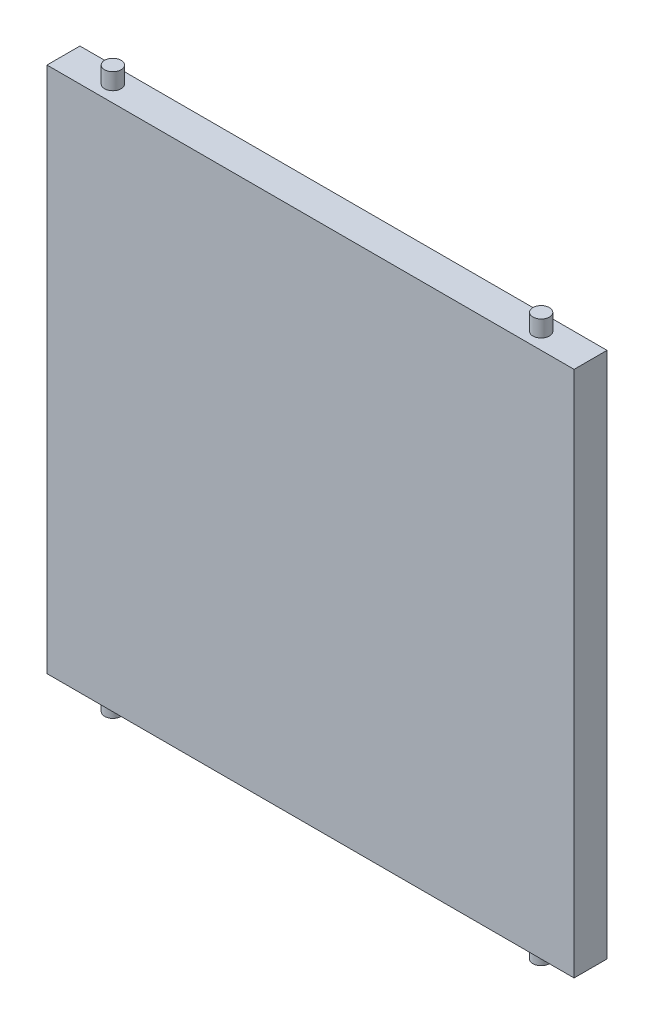
ISO-10303-21;
HEADER;
FILE_DESCRIPTION(('STEP AP214'),'2;1');
FILE_NAME('part.step','',(''),(''),'','','');
FILE_SCHEMA(('AUTOMOTIVE_DESIGN { 1 0 10303 214 1 1 1 1 }'));
ENDSEC;
DATA;
#1=APPLICATION_CONTEXT('core data for automotive mechanical design processes');
#2=APPLICATION_PROTOCOL_DEFINITION('international standard','automotive_design',2000,#1);
#3=PRODUCT_CONTEXT('',#1,'mechanical');
#4=PRODUCT('Part','Part','',(#3));
#5=PRODUCT_RELATED_PRODUCT_CATEGORY('part','',(#4));
#6=PRODUCT_DEFINITION_FORMATION('','',#4);
#7=PRODUCT_DEFINITION_CONTEXT('part definition',#1,'design');
#8=PRODUCT_DEFINITION('design','',#6,#7);
#9=PRODUCT_DEFINITION_SHAPE('','',#8);
#10=(LENGTH_UNIT() NAMED_UNIT(*) SI_UNIT(.MILLI.,.METRE.));
#11=(NAMED_UNIT(*) PLANE_ANGLE_UNIT() SI_UNIT($,.RADIAN.));
#12=(NAMED_UNIT(*) SI_UNIT($,.STERADIAN.) SOLID_ANGLE_UNIT());
#13=UNCERTAINTY_MEASURE_WITH_UNIT(LENGTH_MEASURE(1.E-05),#10,'distance_accuracy_value','');
#14=(GEOMETRIC_REPRESENTATION_CONTEXT(3) GLOBAL_UNCERTAINTY_ASSIGNED_CONTEXT((#13)) GLOBAL_UNIT_ASSIGNED_CONTEXT((#10,
#11,#12)) REPRESENTATION_CONTEXT('',''));
#15=CARTESIAN_POINT('',(0.,0.,0.));
#16=DIRECTION('',(0.,0.,1.));
#17=DIRECTION('',(1.,0.,0.));
#18=AXIS2_PLACEMENT_3D('',#15,#16,#17);
#19=CARTESIAN_POINT('',(80.,-80.,10.));
#20=DIRECTION('',(-1.,0.,0.));
#21=DIRECTION('',(0.,0.,1.));
#22=AXIS2_PLACEMENT_3D('',#19,#20,#21);
#23=PLANE('',#22);
#24=DIRECTION('',(0.,1.,0.));
#25=VECTOR('',#24,1.);
#26=CARTESIAN_POINT('',(80.,-80.,0.));
#27=LINE('',#26,#25);
#28=CARTESIAN_POINT('',(80.,-80.,0.));
#29=VERTEX_POINT('',#28);
#30=CARTESIAN_POINT('',(80.,80.,0.));
#31=VERTEX_POINT('',#30);
#32=EDGE_CURVE('E104',#29,#31,#27,.T.);
#33=ORIENTED_EDGE('',*,*,#32,.T.);
#34=DIRECTION('',(0.,0.,-1.));
#35=VECTOR('',#34,1.);
#36=CARTESIAN_POINT('',(80.,80.,10.));
#37=LINE('',#36,#35);
#38=CARTESIAN_POINT('',(80.,80.,10.));
#39=VERTEX_POINT('',#38);
#40=EDGE_CURVE('E95',#39,#31,#37,.T.);
#41=ORIENTED_EDGE('',*,*,#40,.F.);
#42=DIRECTION('',(0.,1.,0.));
#43=VECTOR('',#42,1.);
#44=CARTESIAN_POINT('',(80.,-80.,10.));
#45=LINE('',#44,#43);
#46=CARTESIAN_POINT('',(80.,-80.,10.));
#47=VERTEX_POINT('',#46);
#48=EDGE_CURVE('E89',#47,#39,#45,.T.);
#49=ORIENTED_EDGE('',*,*,#48,.F.);
#50=DIRECTION('',(0.,0.,-1.));
#51=VECTOR('',#50,1.);
#52=CARTESIAN_POINT('',(80.,-80.,10.));
#53=LINE('',#52,#51);
#54=EDGE_CURVE('E100',#47,#29,#53,.T.);
#55=ORIENTED_EDGE('',*,*,#54,.T.);
#56=EDGE_LOOP('',(#33,#41,#49,#55));
#57=FACE_BOUND('',#56,.T.);
#58=ADVANCED_FACE('F36',(#57),#23,.F.);
#59=CARTESIAN_POINT('',(-80.,80.,10.));
#60=DIRECTION('',(0.,-1.,0.));
#61=DIRECTION('',(0.,0.,-1.));
#62=AXIS2_PLACEMENT_3D('',#59,#60,#61);
#63=PLANE('',#62);
#64=CARTESIAN_POINT('',(65.,80.,4.99999999999998));
#65=DIRECTION('',(0.,-1.,0.));
#66=DIRECTION('',(0.,0.,-1.));
#67=AXIS2_PLACEMENT_3D('',#64,#65,#66);
#68=CIRCLE('',#67,2.5);
#69=CARTESIAN_POINT('',(65.,80.,2.49999999999999));
#70=VERTEX_POINT('',#69);
#71=EDGE_CURVE('E11',#70,#70,#68,.F.);
#72=ORIENTED_EDGE('',*,*,#71,.F.);
#73=EDGE_LOOP('',(#72));
#74=FACE_BOUND('',#73,.T.);
#75=CARTESIAN_POINT('',(-65.,80.,5.));
#76=DIRECTION('',(0.,-1.,0.));
#77=DIRECTION('',(0.,0.,-1.));
#78=AXIS2_PLACEMENT_3D('',#75,#76,#77);
#79=CIRCLE('',#78,2.50000000000001);
#80=CARTESIAN_POINT('',(-65.,80.,2.49999999999999));
#81=VERTEX_POINT('',#80);
#82=EDGE_CURVE('E115',#81,#81,#79,.F.);
#83=ORIENTED_EDGE('',*,*,#82,.F.);
#84=EDGE_LOOP('',(#83));
#85=FACE_BOUND('',#84,.T.);
#86=DIRECTION('',(-1.,0.,0.));
#87=VECTOR('',#86,1.);
#88=CARTESIAN_POINT('',(-80.,80.,0.));
#89=LINE('',#88,#87);
#90=CARTESIAN_POINT('',(-80.,80.,0.));
#91=VERTEX_POINT('',#90);
#92=EDGE_CURVE('E94',#31,#91,#89,.T.);
#93=ORIENTED_EDGE('',*,*,#92,.T.);
#94=DIRECTION('',(0.,0.,-1.));
#95=VECTOR('',#94,1.);
#96=CARTESIAN_POINT('',(-80.,80.,10.));
#97=LINE('',#96,#95);
#98=CARTESIAN_POINT('',(-80.,80.,10.));
#99=VERTEX_POINT('',#98);
#100=EDGE_CURVE('E92',#99,#91,#97,.T.);
#101=ORIENTED_EDGE('',*,*,#100,.F.);
#102=DIRECTION('',(-1.,0.,0.));
#103=VECTOR('',#102,1.);
#104=CARTESIAN_POINT('',(-80.,80.,10.));
#105=LINE('',#104,#103);
#106=EDGE_CURVE('E84',#39,#99,#105,.T.);
#107=ORIENTED_EDGE('',*,*,#106,.F.);
#108=ORIENTED_EDGE('',*,*,#40,.T.);
#109=EDGE_LOOP('',(#93,#101,#107,#108));
#110=FACE_BOUND('',#109,.T.);
#111=ADVANCED_FACE('F93',(#74,#85,#110),#63,.F.);
#112=CARTESIAN_POINT('',(-80.,-80.,10.));
#113=DIRECTION('',(1.,0.,0.));
#114=DIRECTION('',(0.,0.,-1.));
#115=AXIS2_PLACEMENT_3D('',#112,#113,#114);
#116=PLANE('',#115);
#117=DIRECTION('',(0.,-1.,0.));
#118=VECTOR('',#117,1.);
#119=CARTESIAN_POINT('',(-80.,-80.,0.));
#120=LINE('',#119,#118);
#121=CARTESIAN_POINT('',(-80.,-80.,0.));
#122=VERTEX_POINT('',#121);
#123=EDGE_CURVE('E70',#91,#122,#120,.T.);
#124=ORIENTED_EDGE('',*,*,#123,.T.);
#125=DIRECTION('',(0.,0.,-1.));
#126=VECTOR('',#125,1.);
#127=CARTESIAN_POINT('',(-80.,-80.,10.));
#128=LINE('',#127,#126);
#129=CARTESIAN_POINT('',(-80.,-80.,10.));
#130=VERTEX_POINT('',#129);
#131=EDGE_CURVE('E96',#130,#122,#128,.T.);
#132=ORIENTED_EDGE('',*,*,#131,.F.);
#133=DIRECTION('',(0.,-1.,0.));
#134=VECTOR('',#133,1.);
#135=CARTESIAN_POINT('',(-80.,-80.,10.));
#136=LINE('',#135,#134);
#137=EDGE_CURVE('E87',#99,#130,#136,.T.);
#138=ORIENTED_EDGE('',*,*,#137,.F.);
#139=ORIENTED_EDGE('',*,*,#100,.T.);
#140=EDGE_LOOP('',(#124,#132,#138,#139));
#141=FACE_BOUND('',#140,.T.);
#142=ADVANCED_FACE('F98',(#141),#116,.F.);
#143=CARTESIAN_POINT('',(-80.,-80.,10.));
#144=DIRECTION('',(0.,1.,0.));
#145=DIRECTION('',(-1.,0.,0.));
#146=AXIS2_PLACEMENT_3D('',#143,#144,#145);
#147=PLANE('',#146);
#148=CARTESIAN_POINT('',(65.,-80.,4.99999999999998));
#149=DIRECTION('',(0.,1.,0.));
#150=DIRECTION('',(-1.,0.,0.));
#151=AXIS2_PLACEMENT_3D('',#148,#149,#150);
#152=CIRCLE('',#151,2.5);
#153=CARTESIAN_POINT('',(62.5,-80.,4.99999999999998));
#154=VERTEX_POINT('',#153);
#155=EDGE_CURVE('E39',#154,#154,#152,.F.);
#156=ORIENTED_EDGE('',*,*,#155,.F.);
#157=EDGE_LOOP('',(#156));
#158=FACE_BOUND('',#157,.T.);
#159=CARTESIAN_POINT('',(-65.,-80.,5.));
#160=DIRECTION('',(0.,1.,0.));
#161=DIRECTION('',(-1.,0.,0.));
#162=AXIS2_PLACEMENT_3D('',#159,#160,#161);
#163=CIRCLE('',#162,2.50000000000001);
#164=CARTESIAN_POINT('',(-67.5,-80.,5.));
#165=VERTEX_POINT('',#164);
#166=EDGE_CURVE('E113',#165,#165,#163,.F.);
#167=ORIENTED_EDGE('',*,*,#166,.F.);
#168=EDGE_LOOP('',(#167));
#169=FACE_BOUND('',#168,.T.);
#170=DIRECTION('',(1.,0.,0.));
#171=VECTOR('',#170,1.);
#172=CARTESIAN_POINT('',(-80.,-80.,0.));
#173=LINE('',#172,#171);
#174=EDGE_CURVE('E76',#122,#29,#173,.T.);
#175=ORIENTED_EDGE('',*,*,#174,.T.);
#176=ORIENTED_EDGE('',*,*,#54,.F.);
#177=DIRECTION('',(1.,0.,0.));
#178=VECTOR('',#177,1.);
#179=CARTESIAN_POINT('',(-80.,-80.,10.));
#180=LINE('',#179,#178);
#181=EDGE_CURVE('E53',#130,#47,#180,.T.);
#182=ORIENTED_EDGE('',*,*,#181,.F.);
#183=ORIENTED_EDGE('',*,*,#131,.T.);
#184=EDGE_LOOP('',(#175,#176,#182,#183));
#185=FACE_BOUND('',#184,.T.);
#186=ADVANCED_FACE('F151',(#158,#169,#185),#147,.F.);
#187=CARTESIAN_POINT('',(0.,0.,10.));
#188=DIRECTION('',(0.,0.,-1.));
#189=DIRECTION('',(-1.,0.,0.));
#190=AXIS2_PLACEMENT_3D('',#187,#188,#189);
#191=PLANE('',#190);
#192=ORIENTED_EDGE('',*,*,#48,.T.);
#193=ORIENTED_EDGE('',*,*,#106,.T.);
#194=ORIENTED_EDGE('',*,*,#137,.T.);
#195=ORIENTED_EDGE('',*,*,#181,.T.);
#196=EDGE_LOOP('',(#192,#193,#194,#195));
#197=FACE_BOUND('',#196,.T.);
#198=ADVANCED_FACE('F85',(#197),#191,.F.);
#199=CARTESIAN_POINT('',(0.,0.,0.));
#200=DIRECTION('',(0.,0.,-1.));
#201=DIRECTION('',(-1.,0.,0.));
#202=AXIS2_PLACEMENT_3D('',#199,#200,#201);
#203=PLANE('',#202);
#204=ORIENTED_EDGE('',*,*,#32,.F.);
#205=ORIENTED_EDGE('',*,*,#174,.F.);
#206=ORIENTED_EDGE('',*,*,#123,.F.);
#207=ORIENTED_EDGE('',*,*,#92,.F.);
#208=EDGE_LOOP('',(#204,#205,#206,#207));
#209=FACE_BOUND('',#208,.T.);
#210=ADVANCED_FACE('F158',(#209),#203,.T.);
#211=CARTESIAN_POINT('',(-65.,-85.,5.));
#212=DIRECTION('',(0.,1.,0.));
#213=DIRECTION('',(0.,0.,1.));
#214=AXIS2_PLACEMENT_3D('',#211,#212,#213);
#215=PLANE('',#214);
#216=CARTESIAN_POINT('',(-65.,-85.,5.));
#217=DIRECTION('',(0.,1.,0.));
#218=DIRECTION('',(0.,0.,1.));
#219=AXIS2_PLACEMENT_3D('',#216,#217,#218);
#220=CIRCLE('',#219,2.50000000000001);
#221=CARTESIAN_POINT('',(-65.,-85.,7.50000000000001));
#222=VERTEX_POINT('',#221);
#223=EDGE_CURVE('E124',#222,#222,#220,.T.);
#224=ORIENTED_EDGE('',*,*,#223,.F.);
#225=EDGE_LOOP('',(#224));
#226=FACE_BOUND('',#225,.T.);
#227=ADVANCED_FACE('F161',(#226),#215,.F.);
#228=CARTESIAN_POINT('',(-65.,85.,5.));
#229=DIRECTION('',(0.,-1.,0.));
#230=DIRECTION('',(0.,0.,-1.));
#231=AXIS2_PLACEMENT_3D('',#228,#229,#230);
#232=CYLINDRICAL_SURFACE('',#231,2.50000000000001);
#233=ORIENTED_EDGE('',*,*,#223,.T.);
#234=EDGE_LOOP('',(#233));
#235=FACE_BOUND('',#234,.T.);
#236=ORIENTED_EDGE('',*,*,#166,.T.);
#237=EDGE_LOOP('',(#236));
#238=FACE_BOUND('',#237,.T.);
#239=ADVANCED_FACE('F169',(#235,#238),#232,.T.);
#240=CARTESIAN_POINT('',(-65.,85.,5.));
#241=DIRECTION('',(0.,1.,0.));
#242=DIRECTION('',(0.,0.,1.));
#243=AXIS2_PLACEMENT_3D('',#240,#241,#242);
#244=CIRCLE('',#243,2.50000000000001);
#245=CARTESIAN_POINT('',(-65.,85.,7.50000000000001));
#246=VERTEX_POINT('',#245);
#247=EDGE_CURVE('E107',#246,#246,#244,.T.);
#248=ORIENTED_EDGE('',*,*,#247,.F.);
#249=EDGE_LOOP('',(#248));
#250=FACE_BOUND('',#249,.T.);
#251=ORIENTED_EDGE('',*,*,#82,.T.);
#252=EDGE_LOOP('',(#251));
#253=FACE_BOUND('',#252,.T.);
#254=ADVANCED_FACE('F165',(#250,#253),#232,.T.);
#255=CARTESIAN_POINT('',(-65.,85.,5.));
#256=DIRECTION('',(0.,1.,0.));
#257=DIRECTION('',(0.,0.,1.));
#258=AXIS2_PLACEMENT_3D('',#255,#256,#257);
#259=PLANE('',#258);
#260=ORIENTED_EDGE('',*,*,#247,.T.);
#261=EDGE_LOOP('',(#260));
#262=FACE_BOUND('',#261,.T.);
#263=ADVANCED_FACE('F168',(#262),#259,.T.);
#264=CARTESIAN_POINT('',(65.,-85.,4.99999999999998));
#265=DIRECTION('',(0.,-1.,0.));
#266=DIRECTION('',(0.,0.,-1.));
#267=AXIS2_PLACEMENT_3D('',#264,#265,#266);
#268=PLANE('',#267);
#269=CARTESIAN_POINT('',(65.,-85.,4.99999999999998));
#270=DIRECTION('',(0.,1.,0.));
#271=DIRECTION('',(0.,0.,-1.));
#272=AXIS2_PLACEMENT_3D('',#269,#270,#271);
#273=CIRCLE('',#272,2.5);
#274=CARTESIAN_POINT('',(65.,-85.,2.49999999999999));
#275=VERTEX_POINT('',#274);
#276=EDGE_CURVE('E130',#275,#275,#273,.T.);
#277=ORIENTED_EDGE('',*,*,#276,.F.);
#278=EDGE_LOOP('',(#277));
#279=FACE_BOUND('',#278,.T.);
#280=ADVANCED_FACE('F175',(#279),#268,.T.);
#281=CARTESIAN_POINT('',(65.,85.,4.99999999999998));
#282=DIRECTION('',(0.,-1.,0.));
#283=DIRECTION('',(0.,0.,-1.));
#284=AXIS2_PLACEMENT_3D('',#281,#282,#283);
#285=CYLINDRICAL_SURFACE('',#284,2.5);
#286=ORIENTED_EDGE('',*,*,#276,.T.);
#287=EDGE_LOOP('',(#286));
#288=FACE_BOUND('',#287,.T.);
#289=ORIENTED_EDGE('',*,*,#155,.T.);
#290=EDGE_LOOP('',(#289));
#291=FACE_BOUND('',#290,.T.);
#292=ADVANCED_FACE('F141',(#288,#291),#285,.T.);
#293=CARTESIAN_POINT('',(65.,85.,4.99999999999998));
#294=DIRECTION('',(0.,1.,0.));
#295=DIRECTION('',(0.,0.,-1.));
#296=AXIS2_PLACEMENT_3D('',#293,#294,#295);
#297=CIRCLE('',#296,2.5);
#298=CARTESIAN_POINT('',(65.,85.,2.49999999999999));
#299=VERTEX_POINT('',#298);
#300=EDGE_CURVE('E127',#299,#299,#297,.T.);
#301=ORIENTED_EDGE('',*,*,#300,.F.);
#302=EDGE_LOOP('',(#301));
#303=FACE_BOUND('',#302,.T.);
#304=ORIENTED_EDGE('',*,*,#71,.T.);
#305=EDGE_LOOP('',(#304));
#306=FACE_BOUND('',#305,.T.);
#307=ADVANCED_FACE('F138',(#303,#306),#285,.T.);
#308=CARTESIAN_POINT('',(65.,85.,4.99999999999998));
#309=DIRECTION('',(0.,-1.,0.));
#310=DIRECTION('',(0.,0.,-1.));
#311=AXIS2_PLACEMENT_3D('',#308,#309,#310);
#312=PLANE('',#311);
#313=ORIENTED_EDGE('',*,*,#300,.T.);
#314=EDGE_LOOP('',(#313));
#315=FACE_BOUND('',#314,.T.);
#316=ADVANCED_FACE('F136',(#315),#312,.F.);
#317=CLOSED_SHELL('',(#58,#111,#142,#186,#198,#210,#227,#239,#254,#263,#280,#292,#307,#316));
#318=MANIFOLD_SOLID_BREP('B2',#317);
#319=ADVANCED_BREP_SHAPE_REPRESENTATION('',(#18,#318),#14);
#320=SHAPE_DEFINITION_REPRESENTATION(#9,#319);
ENDSEC;
END-ISO-10303-21;
